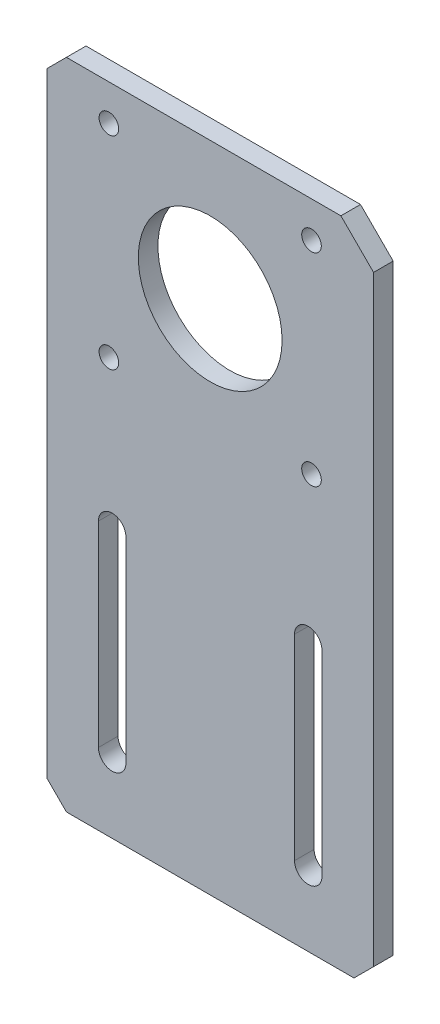
ISO-10303-21;
HEADER;
FILE_DESCRIPTION(('STEP AP214'),'2;1');
FILE_NAME('part.step','',(''),(''),'','','');
FILE_SCHEMA(('AUTOMOTIVE_DESIGN { 1 0 10303 214 1 1 1 1 }'));
ENDSEC;
DATA;
#1=APPLICATION_CONTEXT('core data for automotive mechanical design processes');
#2=APPLICATION_PROTOCOL_DEFINITION('international standard','automotive_design',2000,#1);
#3=PRODUCT_CONTEXT('',#1,'mechanical');
#4=PRODUCT('Part','Part','',(#3));
#5=PRODUCT_RELATED_PRODUCT_CATEGORY('part','',(#4));
#6=PRODUCT_DEFINITION_FORMATION('','',#4);
#7=PRODUCT_DEFINITION_CONTEXT('part definition',#1,'design');
#8=PRODUCT_DEFINITION('design','',#6,#7);
#9=PRODUCT_DEFINITION_SHAPE('','',#8);
#10=(LENGTH_UNIT() NAMED_UNIT(*) SI_UNIT(.MILLI.,.METRE.));
#11=(NAMED_UNIT(*) PLANE_ANGLE_UNIT() SI_UNIT($,.RADIAN.));
#12=(NAMED_UNIT(*) SI_UNIT($,.STERADIAN.) SOLID_ANGLE_UNIT());
#13=UNCERTAINTY_MEASURE_WITH_UNIT(LENGTH_MEASURE(1.E-05),#10,'distance_accuracy_value','');
#14=(GEOMETRIC_REPRESENTATION_CONTEXT(3) GLOBAL_UNCERTAINTY_ASSIGNED_CONTEXT((#13)) GLOBAL_UNIT_ASSIGNED_CONTEXT((#10,
#11,#12)) REPRESENTATION_CONTEXT('',''));
#15=CARTESIAN_POINT('',(0.,0.,0.));
#16=DIRECTION('',(0.,0.,1.));
#17=DIRECTION('',(1.,0.,0.));
#18=AXIS2_PLACEMENT_3D('',#15,#16,#17);
#19=CARTESIAN_POINT('',(22.5,22.5,3.));
#20=DIRECTION('',(0.707106781186547,0.707106781186548,0.));
#21=DIRECTION('',(-0.707106781186548,0.707106781186547,0.));
#22=AXIS2_PLACEMENT_3D('',#19,#20,#21);
#23=PLANE('',#22);
#24=DIRECTION('',(0.707106781186548,-0.707106781186547,0.));
#25=VECTOR('',#24,1.);
#26=CARTESIAN_POINT('',(22.5,22.5,0.));
#27=LINE('',#26,#25);
#28=CARTESIAN_POINT('',(45.,0.,0.));
#29=VERTEX_POINT('',#28);
#30=CARTESIAN_POINT('',(50.,-4.99999999999999,0.));
#31=VERTEX_POINT('',#30);
#32=EDGE_CURVE('E251',#29,#31,#27,.T.);
#33=ORIENTED_EDGE('',*,*,#32,.F.);
#34=DIRECTION('',(0.,0.,-1.));
#35=VECTOR('',#34,1.);
#36=CARTESIAN_POINT('',(45.,0.,3.));
#37=LINE('',#36,#35);
#38=CARTESIAN_POINT('',(45.,0.,3.));
#39=VERTEX_POINT('',#38);
#40=EDGE_CURVE('E269',#39,#29,#37,.T.);
#41=ORIENTED_EDGE('',*,*,#40,.F.);
#42=DIRECTION('',(0.707106781186548,-0.707106781186547,0.));
#43=VECTOR('',#42,1.);
#44=CARTESIAN_POINT('',(22.5,22.5,3.));
#45=LINE('',#44,#43);
#46=CARTESIAN_POINT('',(50.,-4.99999999999999,3.));
#47=VERTEX_POINT('',#46);
#48=EDGE_CURVE('E202',#39,#47,#45,.T.);
#49=ORIENTED_EDGE('',*,*,#48,.T.);
#50=DIRECTION('',(0.,0.,-1.));
#51=VECTOR('',#50,1.);
#52=CARTESIAN_POINT('',(50.,-4.99999999999999,3.));
#53=LINE('',#52,#51);
#54=EDGE_CURVE('E267',#47,#31,#53,.T.);
#55=ORIENTED_EDGE('',*,*,#54,.T.);
#56=EDGE_LOOP('',(#33,#41,#49,#55));
#57=FACE_BOUND('',#56,.T.);
#58=ADVANCED_FACE('F35',(#57),#23,.T.);
#59=CARTESIAN_POINT('',(0.,0.,3.));
#60=DIRECTION('',(0.,1.,0.));
#61=DIRECTION('',(0.,0.,1.));
#62=AXIS2_PLACEMENT_3D('',#59,#60,#61);
#63=PLANE('',#62);
#64=DIRECTION('',(1.,0.,0.));
#65=VECTOR('',#64,1.);
#66=CARTESIAN_POINT('',(0.,0.,0.));
#67=LINE('',#66,#65);
#68=CARTESIAN_POINT('',(3.00000000000002,0.,0.));
#69=VERTEX_POINT('',#68);
#70=EDGE_CURVE('E254',#69,#29,#67,.T.);
#71=ORIENTED_EDGE('',*,*,#70,.F.);
#72=DIRECTION('',(0.,0.,1.));
#73=VECTOR('',#72,1.);
#74=CARTESIAN_POINT('',(3.00000000000002,0.,3.));
#75=LINE('',#74,#73);
#76=CARTESIAN_POINT('',(3.00000000000002,0.,3.));
#77=VERTEX_POINT('',#76);
#78=EDGE_CURVE('E11',#69,#77,#75,.T.);
#79=ORIENTED_EDGE('',*,*,#78,.T.);
#80=DIRECTION('',(1.,0.,0.));
#81=VECTOR('',#80,1.);
#82=CARTESIAN_POINT('',(0.,0.,3.));
#83=LINE('',#82,#81);
#84=EDGE_CURVE('E205',#77,#39,#83,.T.);
#85=ORIENTED_EDGE('',*,*,#84,.T.);
#86=ORIENTED_EDGE('',*,*,#40,.T.);
#87=EDGE_LOOP('',(#71,#79,#85,#86));
#88=FACE_BOUND('',#87,.T.);
#89=ADVANCED_FACE('F346',(#88),#63,.T.);
#90=CARTESIAN_POINT('',(0.,0.,3.));
#91=DIRECTION('',(1.,0.,0.));
#92=DIRECTION('',(0.,1.,0.));
#93=AXIS2_PLACEMENT_3D('',#90,#91,#92);
#94=PLANE('',#93);
#95=DIRECTION('',(0.,-1.,0.));
#96=VECTOR('',#95,1.);
#97=CARTESIAN_POINT('',(0.,0.,0.));
#98=LINE('',#97,#96);
#99=CARTESIAN_POINT('',(0.,-3.00000000000002,0.));
#100=VERTEX_POINT('',#99);
#101=CARTESIAN_POINT('',(0.,-97.,0.));
#102=VERTEX_POINT('',#101);
#103=EDGE_CURVE('E256',#100,#102,#98,.T.);
#104=ORIENTED_EDGE('',*,*,#103,.T.);
#105=DIRECTION('',(0.,0.,1.));
#106=VECTOR('',#105,1.);
#107=CARTESIAN_POINT('',(0.,-97.,3.));
#108=LINE('',#107,#106);
#109=CARTESIAN_POINT('',(0.,-97.,3.));
#110=VERTEX_POINT('',#109);
#111=EDGE_CURVE('E298',#102,#110,#108,.T.);
#112=ORIENTED_EDGE('',*,*,#111,.T.);
#113=DIRECTION('',(0.,-1.,0.));
#114=VECTOR('',#113,1.);
#115=CARTESIAN_POINT('',(0.,0.,3.));
#116=LINE('',#115,#114);
#117=CARTESIAN_POINT('',(0.,-3.00000000000002,3.));
#118=VERTEX_POINT('',#117);
#119=EDGE_CURVE('E207',#118,#110,#116,.T.);
#120=ORIENTED_EDGE('',*,*,#119,.F.);
#121=DIRECTION('',(0.,0.,-1.));
#122=VECTOR('',#121,1.);
#123=CARTESIAN_POINT('',(0.,-3.00000000000002,0.));
#124=LINE('',#123,#122);
#125=EDGE_CURVE('E295',#118,#100,#124,.T.);
#126=ORIENTED_EDGE('',*,*,#125,.T.);
#127=EDGE_LOOP('',(#104,#112,#120,#126));
#128=FACE_BOUND('',#127,.T.);
#129=ADVANCED_FACE('F351',(#128),#94,.F.);
#130=CARTESIAN_POINT('',(0.,-100.,3.));
#131=DIRECTION('',(0.,1.,0.));
#132=DIRECTION('',(0.,0.,1.));
#133=AXIS2_PLACEMENT_3D('',#130,#131,#132);
#134=PLANE('',#133);
#135=DIRECTION('',(1.,0.,0.));
#136=VECTOR('',#135,1.);
#137=CARTESIAN_POINT('',(0.,-100.,3.));
#138=LINE('',#137,#136);
#139=CARTESIAN_POINT('',(3.00000000000001,-100.,3.));
#140=VERTEX_POINT('',#139);
#141=CARTESIAN_POINT('',(47.,-100.,3.));
#142=VERTEX_POINT('',#141);
#143=EDGE_CURVE('E210',#140,#142,#138,.T.);
#144=ORIENTED_EDGE('',*,*,#143,.F.);
#145=DIRECTION('',(0.,0.,-1.));
#146=VECTOR('',#145,1.);
#147=CARTESIAN_POINT('',(3.00000000000001,-100.,3.));
#148=LINE('',#147,#146);
#149=CARTESIAN_POINT('',(3.00000000000001,-100.,0.));
#150=VERTEX_POINT('',#149);
#151=EDGE_CURVE('E286',#140,#150,#148,.T.);
#152=ORIENTED_EDGE('',*,*,#151,.T.);
#153=DIRECTION('',(1.,0.,0.));
#154=VECTOR('',#153,1.);
#155=CARTESIAN_POINT('',(0.,-100.,0.));
#156=LINE('',#155,#154);
#157=CARTESIAN_POINT('',(47.,-100.,0.));
#158=VERTEX_POINT('',#157);
#159=EDGE_CURVE('E259',#150,#158,#156,.T.);
#160=ORIENTED_EDGE('',*,*,#159,.T.);
#161=DIRECTION('',(0.,0.,1.));
#162=VECTOR('',#161,1.);
#163=CARTESIAN_POINT('',(47.,-100.,3.));
#164=LINE('',#163,#162);
#165=EDGE_CURVE('E273',#158,#142,#164,.T.);
#166=ORIENTED_EDGE('',*,*,#165,.T.);
#167=EDGE_LOOP('',(#144,#152,#160,#166));
#168=FACE_BOUND('',#167,.T.);
#169=ADVANCED_FACE('F382',(#168),#134,.F.);
#170=CARTESIAN_POINT('',(10.,-89.,3.));
#171=DIRECTION('',(0.,0.,-1.));
#172=DIRECTION('',(-1.,0.,0.));
#173=AXIS2_PLACEMENT_3D('',#170,#171,#172);
#174=CYLINDRICAL_SURFACE('',#173,2.09999999999999);
#175=CARTESIAN_POINT('',(10.,-89.,0.));
#176=DIRECTION('',(0.,0.,1.));
#177=DIRECTION('',(1.,0.,0.));
#178=AXIS2_PLACEMENT_3D('',#175,#176,#177);
#179=CIRCLE('',#178,2.09999999999999);
#180=CARTESIAN_POINT('',(7.90000000000002,-89.,0.));
#181=VERTEX_POINT('',#180);
#182=CARTESIAN_POINT('',(12.1,-89.,0.));
#183=VERTEX_POINT('',#182);
#184=EDGE_CURVE('E230',#181,#183,#179,.T.);
#185=ORIENTED_EDGE('',*,*,#184,.F.);
#186=DIRECTION('',(0.,0.,-1.));
#187=VECTOR('',#186,1.);
#188=CARTESIAN_POINT('',(7.90000000000002,-89.,3.));
#189=LINE('',#188,#187);
#190=CARTESIAN_POINT('',(7.90000000000002,-89.,3.));
#191=VERTEX_POINT('',#190);
#192=EDGE_CURVE('E270',#191,#181,#189,.T.);
#193=ORIENTED_EDGE('',*,*,#192,.F.);
#194=CARTESIAN_POINT('',(10.,-89.,3.));
#195=DIRECTION('',(0.,0.,1.));
#196=DIRECTION('',(1.,0.,0.));
#197=AXIS2_PLACEMENT_3D('',#194,#195,#196);
#198=CIRCLE('',#197,2.09999999999999);
#199=CARTESIAN_POINT('',(12.1,-89.,3.));
#200=VERTEX_POINT('',#199);
#201=EDGE_CURVE('E182',#191,#200,#198,.T.);
#202=ORIENTED_EDGE('',*,*,#201,.T.);
#203=DIRECTION('',(0.,0.,-1.));
#204=VECTOR('',#203,1.);
#205=CARTESIAN_POINT('',(12.1,-89.,3.));
#206=LINE('',#205,#204);
#207=EDGE_CURVE('E159',#200,#183,#206,.T.);
#208=ORIENTED_EDGE('',*,*,#207,.T.);
#209=EDGE_LOOP('',(#185,#193,#202,#208));
#210=FACE_BOUND('',#209,.T.);
#211=ADVANCED_FACE('F378',(#210),#174,.F.);
#212=CARTESIAN_POINT('',(7.9,0.,3.));
#213=DIRECTION('',(1.,0.,0.));
#214=DIRECTION('',(0.,1.,0.));
#215=AXIS2_PLACEMENT_3D('',#212,#213,#214);
#216=PLANE('',#215);
#217=DIRECTION('',(0.,-1.,0.));
#218=VECTOR('',#217,1.);
#219=CARTESIAN_POINT('',(7.9,0.,0.));
#220=LINE('',#219,#218);
#221=CARTESIAN_POINT('',(7.90000000000001,-59.,0.));
#222=VERTEX_POINT('',#221);
#223=EDGE_CURVE('E233',#222,#181,#220,.T.);
#224=ORIENTED_EDGE('',*,*,#223,.F.);
#225=DIRECTION('',(0.,0.,-1.));
#226=VECTOR('',#225,1.);
#227=CARTESIAN_POINT('',(7.90000000000001,-59.,3.));
#228=LINE('',#227,#226);
#229=CARTESIAN_POINT('',(7.90000000000001,-59.,3.));
#230=VERTEX_POINT('',#229);
#231=EDGE_CURVE('E278',#230,#222,#228,.T.);
#232=ORIENTED_EDGE('',*,*,#231,.F.);
#233=DIRECTION('',(0.,-1.,0.));
#234=VECTOR('',#233,1.);
#235=CARTESIAN_POINT('',(7.9,0.,3.));
#236=LINE('',#235,#234);
#237=EDGE_CURVE('E185',#230,#191,#236,.T.);
#238=ORIENTED_EDGE('',*,*,#237,.T.);
#239=ORIENTED_EDGE('',*,*,#192,.T.);
#240=EDGE_LOOP('',(#224,#232,#238,#239));
#241=FACE_BOUND('',#240,.T.);
#242=ADVANCED_FACE('F374',(#241),#216,.T.);
#243=CARTESIAN_POINT('',(10.,-59.,3.));
#244=DIRECTION('',(0.,0.,-1.));
#245=DIRECTION('',(-1.,0.,0.));
#246=AXIS2_PLACEMENT_3D('',#243,#244,#245);
#247=CYLINDRICAL_SURFACE('',#246,2.1);
#248=CARTESIAN_POINT('',(10.,-59.,0.));
#249=DIRECTION('',(0.,0.,1.));
#250=DIRECTION('',(1.,0.,0.));
#251=AXIS2_PLACEMENT_3D('',#248,#249,#250);
#252=CIRCLE('',#251,2.1);
#253=CARTESIAN_POINT('',(12.1,-59.,0.));
#254=VERTEX_POINT('',#253);
#255=EDGE_CURVE('E236',#222,#254,#252,.F.);
#256=ORIENTED_EDGE('',*,*,#255,.T.);
#257=DIRECTION('',(0.,0.,-1.));
#258=VECTOR('',#257,1.);
#259=CARTESIAN_POINT('',(12.1,-59.,3.));
#260=LINE('',#259,#258);
#261=CARTESIAN_POINT('',(12.1,-59.,3.));
#262=VERTEX_POINT('',#261);
#263=EDGE_CURVE('E275',#262,#254,#260,.T.);
#264=ORIENTED_EDGE('',*,*,#263,.F.);
#265=CARTESIAN_POINT('',(10.,-59.,3.));
#266=DIRECTION('',(0.,0.,1.));
#267=DIRECTION('',(1.,0.,0.));
#268=AXIS2_PLACEMENT_3D('',#265,#266,#267);
#269=CIRCLE('',#268,2.1);
#270=EDGE_CURVE('E188',#230,#262,#269,.F.);
#271=ORIENTED_EDGE('',*,*,#270,.F.);
#272=ORIENTED_EDGE('',*,*,#231,.T.);
#273=EDGE_LOOP('',(#256,#264,#271,#272));
#274=FACE_BOUND('',#273,.T.);
#275=ADVANCED_FACE('F371',(#274),#247,.F.);
#276=CARTESIAN_POINT('',(40.,-59.,3.));
#277=DIRECTION('',(0.,0.,-1.));
#278=DIRECTION('',(-1.,0.,0.));
#279=AXIS2_PLACEMENT_3D('',#276,#277,#278);
#280=CYLINDRICAL_SURFACE('',#279,2.09999999999999);
#281=CARTESIAN_POINT('',(40.,-59.,0.));
#282=DIRECTION('',(0.,0.,1.));
#283=DIRECTION('',(1.,0.,0.));
#284=AXIS2_PLACEMENT_3D('',#281,#282,#283);
#285=CIRCLE('',#284,2.09999999999999);
#286=CARTESIAN_POINT('',(42.1,-59.,0.));
#287=VERTEX_POINT('',#286);
#288=CARTESIAN_POINT('',(37.9,-59.,0.));
#289=VERTEX_POINT('',#288);
#290=EDGE_CURVE('E156',#287,#289,#285,.T.);
#291=ORIENTED_EDGE('',*,*,#290,.F.);
#292=DIRECTION('',(0.,0.,-1.));
#293=VECTOR('',#292,1.);
#294=CARTESIAN_POINT('',(42.1,-59.,3.));
#295=LINE('',#294,#293);
#296=CARTESIAN_POINT('',(42.1,-59.,3.));
#297=VERTEX_POINT('',#296);
#298=EDGE_CURVE('E149',#297,#287,#295,.T.);
#299=ORIENTED_EDGE('',*,*,#298,.F.);
#300=CARTESIAN_POINT('',(40.,-59.,3.));
#301=DIRECTION('',(0.,0.,1.));
#302=DIRECTION('',(1.,0.,0.));
#303=AXIS2_PLACEMENT_3D('',#300,#301,#302);
#304=CIRCLE('',#303,2.09999999999999);
#305=CARTESIAN_POINT('',(37.9,-59.,3.));
#306=VERTEX_POINT('',#305);
#307=EDGE_CURVE('E153',#297,#306,#304,.T.);
#308=ORIENTED_EDGE('',*,*,#307,.T.);
#309=DIRECTION('',(0.,0.,-1.));
#310=VECTOR('',#309,1.);
#311=CARTESIAN_POINT('',(37.9,-59.,3.));
#312=LINE('',#311,#310);
#313=EDGE_CURVE('E220',#306,#289,#312,.T.);
#314=ORIENTED_EDGE('',*,*,#313,.T.);
#315=EDGE_LOOP('',(#291,#299,#308,#314));
#316=FACE_BOUND('',#315,.T.);
#317=ADVANCED_FACE('F151',(#316),#280,.F.);
#318=CARTESIAN_POINT('',(42.1,0.,3.));
#319=DIRECTION('',(1.,0.,0.));
#320=DIRECTION('',(0.,1.,0.));
#321=AXIS2_PLACEMENT_3D('',#318,#319,#320);
#322=PLANE('',#321);
#323=DIRECTION('',(0.,-1.,0.));
#324=VECTOR('',#323,1.);
#325=CARTESIAN_POINT('',(42.1,0.,0.));
#326=LINE('',#325,#324);
#327=CARTESIAN_POINT('',(42.1,-89.,0.));
#328=VERTEX_POINT('',#327);
#329=EDGE_CURVE('E222',#287,#328,#326,.T.);
#330=ORIENTED_EDGE('',*,*,#329,.T.);
#331=DIRECTION('',(0.,0.,-1.));
#332=VECTOR('',#331,1.);
#333=CARTESIAN_POINT('',(42.1,-89.,3.));
#334=LINE('',#333,#332);
#335=CARTESIAN_POINT('',(42.1,-89.,3.));
#336=VERTEX_POINT('',#335);
#337=EDGE_CURVE('E160',#336,#328,#334,.T.);
#338=ORIENTED_EDGE('',*,*,#337,.F.);
#339=DIRECTION('',(0.,-1.,0.));
#340=VECTOR('',#339,1.);
#341=CARTESIAN_POINT('',(42.1,0.,3.));
#342=LINE('',#341,#340);
#343=EDGE_CURVE('E163',#297,#336,#342,.T.);
#344=ORIENTED_EDGE('',*,*,#343,.F.);
#345=ORIENTED_EDGE('',*,*,#298,.T.);
#346=EDGE_LOOP('',(#330,#338,#344,#345));
#347=FACE_BOUND('',#346,.T.);
#348=ADVANCED_FACE('F164',(#347),#322,.F.);
#349=CARTESIAN_POINT('',(40.,-89.,3.));
#350=DIRECTION('',(0.,0.,-1.));
#351=DIRECTION('',(-1.,0.,0.));
#352=AXIS2_PLACEMENT_3D('',#349,#350,#351);
#353=CYLINDRICAL_SURFACE('',#352,2.1);
#354=CARTESIAN_POINT('',(40.,-89.,0.));
#355=DIRECTION('',(0.,0.,1.));
#356=DIRECTION('',(1.,0.,0.));
#357=AXIS2_PLACEMENT_3D('',#354,#355,#356);
#358=CIRCLE('',#357,2.1);
#359=CARTESIAN_POINT('',(37.9,-89.,0.));
#360=VERTEX_POINT('',#359);
#361=EDGE_CURVE('E224',#328,#360,#358,.F.);
#362=ORIENTED_EDGE('',*,*,#361,.T.);
#363=DIRECTION('',(0.,0.,-1.));
#364=VECTOR('',#363,1.);
#365=CARTESIAN_POINT('',(37.9,-89.,3.));
#366=LINE('',#365,#364);
#367=CARTESIAN_POINT('',(37.9,-89.,3.));
#368=VERTEX_POINT('',#367);
#369=EDGE_CURVE('E282',#368,#360,#366,.T.);
#370=ORIENTED_EDGE('',*,*,#369,.F.);
#371=CARTESIAN_POINT('',(40.,-89.,3.));
#372=DIRECTION('',(0.,0.,1.));
#373=DIRECTION('',(1.,0.,0.));
#374=AXIS2_PLACEMENT_3D('',#371,#372,#373);
#375=CIRCLE('',#374,2.1);
#376=EDGE_CURVE('E168',#336,#368,#375,.F.);
#377=ORIENTED_EDGE('',*,*,#376,.F.);
#378=ORIENTED_EDGE('',*,*,#337,.T.);
#379=EDGE_LOOP('',(#362,#370,#377,#378));
#380=FACE_BOUND('',#379,.T.);
#381=ADVANCED_FACE('F387',(#380),#353,.F.);
#382=CARTESIAN_POINT('',(40.5,-36.5,3.));
#383=DIRECTION('',(0.,0.,-1.));
#384=DIRECTION('',(-1.,0.,0.));
#385=AXIS2_PLACEMENT_3D('',#382,#383,#384);
#386=CYLINDRICAL_SURFACE('',#385,1.5);
#387=CARTESIAN_POINT('',(40.5,-36.5,3.));
#388=DIRECTION('',(0.,0.,1.));
#389=DIRECTION('',(1.,0.,0.));
#390=AXIS2_PLACEMENT_3D('',#387,#388,#389);
#391=CIRCLE('',#390,1.5);
#392=CARTESIAN_POINT('',(42.,-36.5,3.));
#393=VERTEX_POINT('',#392);
#394=EDGE_CURVE('E214',#393,#393,#391,.T.);
#395=ORIENTED_EDGE('',*,*,#394,.T.);
#396=EDGE_LOOP('',(#395));
#397=FACE_BOUND('',#396,.T.);
#398=CARTESIAN_POINT('',(40.5,-36.5,0.));
#399=DIRECTION('',(0.,0.,1.));
#400=DIRECTION('',(1.,0.,0.));
#401=AXIS2_PLACEMENT_3D('',#398,#399,#400);
#402=CIRCLE('',#401,1.5);
#403=CARTESIAN_POINT('',(42.,-36.5,0.));
#404=VERTEX_POINT('',#403);
#405=EDGE_CURVE('E177',#404,#404,#402,.T.);
#406=ORIENTED_EDGE('',*,*,#405,.F.);
#407=EDGE_LOOP('',(#406));
#408=FACE_BOUND('',#407,.T.);
#409=ADVANCED_FACE('F390',(#397,#408),#386,.F.);
#410=CARTESIAN_POINT('',(50.,0.,3.));
#411=DIRECTION('',(1.,0.,0.));
#412=DIRECTION('',(0.,1.,0.));
#413=AXIS2_PLACEMENT_3D('',#410,#411,#412);
#414=PLANE('',#413);
#415=DIRECTION('',(0.,-1.,0.));
#416=VECTOR('',#415,1.);
#417=CARTESIAN_POINT('',(50.,0.,3.));
#418=LINE('',#417,#416);
#419=CARTESIAN_POINT('',(50.,-97.,3.));
#420=VERTEX_POINT('',#419);
#421=EDGE_CURVE('E212',#47,#420,#418,.T.);
#422=ORIENTED_EDGE('',*,*,#421,.T.);
#423=DIRECTION('',(0.,0.,-1.));
#424=VECTOR('',#423,1.);
#425=CARTESIAN_POINT('',(50.,-97.,0.));
#426=LINE('',#425,#424);
#427=CARTESIAN_POINT('',(50.,-97.,0.));
#428=VERTEX_POINT('',#427);
#429=EDGE_CURVE('E43',#420,#428,#426,.T.);
#430=ORIENTED_EDGE('',*,*,#429,.T.);
#431=DIRECTION('',(0.,-1.,0.));
#432=VECTOR('',#431,1.);
#433=CARTESIAN_POINT('',(50.,0.,0.));
#434=LINE('',#433,#432);
#435=EDGE_CURVE('E262',#31,#428,#434,.T.);
#436=ORIENTED_EDGE('',*,*,#435,.F.);
#437=ORIENTED_EDGE('',*,*,#54,.F.);
#438=EDGE_LOOP('',(#422,#430,#436,#437));
#439=FACE_BOUND('',#438,.T.);
#440=ADVANCED_FACE('F308',(#439),#414,.T.);
#441=CARTESIAN_POINT('',(25.,-21.,3.));
#442=DIRECTION('',(0.,0.,-1.));
#443=DIRECTION('',(-1.,0.,0.));
#444=AXIS2_PLACEMENT_3D('',#441,#442,#443);
#445=CYLINDRICAL_SURFACE('',#444,11.);
#446=CARTESIAN_POINT('',(25.,-21.,3.));
#447=DIRECTION('',(0.,0.,1.));
#448=DIRECTION('',(1.,0.,0.));
#449=AXIS2_PLACEMENT_3D('',#446,#447,#448);
#450=CIRCLE('',#449,11.);
#451=CARTESIAN_POINT('',(36.,-21.,3.));
#452=VERTEX_POINT('',#451);
#453=EDGE_CURVE('E199',#452,#452,#450,.T.);
#454=ORIENTED_EDGE('',*,*,#453,.T.);
#455=EDGE_LOOP('',(#454));
#456=FACE_BOUND('',#455,.T.);
#457=CARTESIAN_POINT('',(25.,-21.,0.));
#458=DIRECTION('',(0.,0.,1.));
#459=DIRECTION('',(1.,0.,0.));
#460=AXIS2_PLACEMENT_3D('',#457,#458,#459);
#461=CIRCLE('',#460,11.);
#462=CARTESIAN_POINT('',(36.,-21.,0.));
#463=VERTEX_POINT('',#462);
#464=EDGE_CURVE('E248',#463,#463,#461,.T.);
#465=ORIENTED_EDGE('',*,*,#464,.F.);
#466=EDGE_LOOP('',(#465));
#467=FACE_BOUND('',#466,.T.);
#468=ADVANCED_FACE('F355',(#456,#467),#445,.F.);
#469=CARTESIAN_POINT('',(9.5,-5.5,3.));
#470=DIRECTION('',(0.,0.,-1.));
#471=DIRECTION('',(-1.,0.,0.));
#472=AXIS2_PLACEMENT_3D('',#469,#470,#471);
#473=CYLINDRICAL_SURFACE('',#472,1.5);
#474=CARTESIAN_POINT('',(9.5,-5.5,3.));
#475=DIRECTION('',(0.,0.,1.));
#476=DIRECTION('',(1.,0.,0.));
#477=AXIS2_PLACEMENT_3D('',#474,#475,#476);
#478=CIRCLE('',#477,1.5);
#479=CARTESIAN_POINT('',(11.,-5.5,3.));
#480=VERTEX_POINT('',#479);
#481=EDGE_CURVE('E196',#480,#480,#478,.T.);
#482=ORIENTED_EDGE('',*,*,#481,.T.);
#483=EDGE_LOOP('',(#482));
#484=FACE_BOUND('',#483,.T.);
#485=CARTESIAN_POINT('',(9.5,-5.5,0.));
#486=DIRECTION('',(0.,0.,1.));
#487=DIRECTION('',(1.,0.,0.));
#488=AXIS2_PLACEMENT_3D('',#485,#486,#487);
#489=CIRCLE('',#488,1.5);
#490=CARTESIAN_POINT('',(11.,-5.5,0.));
#491=VERTEX_POINT('',#490);
#492=EDGE_CURVE('E245',#491,#491,#489,.T.);
#493=ORIENTED_EDGE('',*,*,#492,.F.);
#494=EDGE_LOOP('',(#493));
#495=FACE_BOUND('',#494,.T.);
#496=ADVANCED_FACE('F358',(#484,#495),#473,.F.);
#497=CARTESIAN_POINT('',(9.5,-36.5,3.));
#498=DIRECTION('',(0.,0.,-1.));
#499=DIRECTION('',(-1.,0.,0.));
#500=AXIS2_PLACEMENT_3D('',#497,#498,#499);
#501=CYLINDRICAL_SURFACE('',#500,1.5);
#502=CARTESIAN_POINT('',(9.5,-36.5,3.));
#503=DIRECTION('',(0.,0.,1.));
#504=DIRECTION('',(1.,0.,0.));
#505=AXIS2_PLACEMENT_3D('',#502,#503,#504);
#506=CIRCLE('',#505,1.5);
#507=CARTESIAN_POINT('',(11.,-36.5,3.));
#508=VERTEX_POINT('',#507);
#509=EDGE_CURVE('E193',#508,#508,#506,.F.);
#510=ORIENTED_EDGE('',*,*,#509,.F.);
#511=EDGE_LOOP('',(#510));
#512=FACE_BOUND('',#511,.T.);
#513=CARTESIAN_POINT('',(9.5,-36.5,0.));
#514=DIRECTION('',(0.,0.,1.));
#515=DIRECTION('',(1.,0.,0.));
#516=AXIS2_PLACEMENT_3D('',#513,#514,#515);
#517=CIRCLE('',#516,1.5);
#518=CARTESIAN_POINT('',(11.,-36.5,0.));
#519=VERTEX_POINT('',#518);
#520=EDGE_CURVE('E242',#519,#519,#517,.F.);
#521=ORIENTED_EDGE('',*,*,#520,.T.);
#522=EDGE_LOOP('',(#521));
#523=FACE_BOUND('',#522,.T.);
#524=ADVANCED_FACE('F362',(#512,#523),#501,.F.);
#525=CARTESIAN_POINT('',(12.1,0.,3.));
#526=DIRECTION('',(1.,0.,0.));
#527=DIRECTION('',(0.,0.,-1.));
#528=AXIS2_PLACEMENT_3D('',#525,#526,#527);
#529=PLANE('',#528);
#530=DIRECTION('',(0.,-1.,0.));
#531=VECTOR('',#530,1.);
#532=CARTESIAN_POINT('',(12.1,0.,0.));
#533=LINE('',#532,#531);
#534=EDGE_CURVE('E239',#254,#183,#533,.T.);
#535=ORIENTED_EDGE('',*,*,#534,.T.);
#536=ORIENTED_EDGE('',*,*,#207,.F.);
#537=DIRECTION('',(0.,-1.,0.));
#538=VECTOR('',#537,1.);
#539=CARTESIAN_POINT('',(12.1,0.,3.));
#540=LINE('',#539,#538);
#541=EDGE_CURVE('E191',#262,#200,#540,.T.);
#542=ORIENTED_EDGE('',*,*,#541,.F.);
#543=ORIENTED_EDGE('',*,*,#263,.T.);
#544=EDGE_LOOP('',(#535,#536,#542,#543));
#545=FACE_BOUND('',#544,.T.);
#546=ADVANCED_FACE('F366',(#545),#529,.F.);
#547=CARTESIAN_POINT('',(37.9,0.,3.));
#548=DIRECTION('',(1.,0.,0.));
#549=DIRECTION('',(0.,0.,-1.));
#550=AXIS2_PLACEMENT_3D('',#547,#548,#549);
#551=PLANE('',#550);
#552=DIRECTION('',(0.,-1.,0.));
#553=VECTOR('',#552,1.);
#554=CARTESIAN_POINT('',(37.9,0.,0.));
#555=LINE('',#554,#553);
#556=EDGE_CURVE('E227',#289,#360,#555,.T.);
#557=ORIENTED_EDGE('',*,*,#556,.F.);
#558=ORIENTED_EDGE('',*,*,#313,.F.);
#559=DIRECTION('',(0.,-1.,0.));
#560=VECTOR('',#559,1.);
#561=CARTESIAN_POINT('',(37.9,0.,3.));
#562=LINE('',#561,#560);
#563=EDGE_CURVE('E173',#306,#368,#562,.T.);
#564=ORIENTED_EDGE('',*,*,#563,.T.);
#565=ORIENTED_EDGE('',*,*,#369,.T.);
#566=EDGE_LOOP('',(#557,#558,#564,#565));
#567=FACE_BOUND('',#566,.T.);
#568=ADVANCED_FACE('F330',(#567),#551,.T.);
#569=CARTESIAN_POINT('',(40.5,-5.5,3.));
#570=DIRECTION('',(0.,0.,-1.));
#571=DIRECTION('',(-1.,0.,0.));
#572=AXIS2_PLACEMENT_3D('',#569,#570,#571);
#573=CYLINDRICAL_SURFACE('',#572,1.5);
#574=CARTESIAN_POINT('',(40.5,-5.5,3.));
#575=DIRECTION('',(0.,0.,1.));
#576=DIRECTION('',(1.,0.,0.));
#577=AXIS2_PLACEMENT_3D('',#574,#575,#576);
#578=CIRCLE('',#577,1.5);
#579=CARTESIAN_POINT('',(42.,-5.5,3.));
#580=VERTEX_POINT('',#579);
#581=EDGE_CURVE('E217',#580,#580,#578,.F.);
#582=ORIENTED_EDGE('',*,*,#581,.F.);
#583=EDGE_LOOP('',(#582));
#584=FACE_BOUND('',#583,.T.);
#585=CARTESIAN_POINT('',(40.5,-5.5,0.));
#586=DIRECTION('',(0.,0.,1.));
#587=DIRECTION('',(1.,0.,0.));
#588=AXIS2_PLACEMENT_3D('',#585,#586,#587);
#589=CIRCLE('',#588,1.5);
#590=CARTESIAN_POINT('',(42.,-5.5,0.));
#591=VERTEX_POINT('',#590);
#592=EDGE_CURVE('E174',#591,#591,#589,.F.);
#593=ORIENTED_EDGE('',*,*,#592,.T.);
#594=EDGE_LOOP('',(#593));
#595=FACE_BOUND('',#594,.T.);
#596=ADVANCED_FACE('F322',(#584,#595),#573,.F.);
#597=CARTESIAN_POINT('',(0.,0.,3.));
#598=DIRECTION('',(0.,0.,1.));
#599=DIRECTION('',(1.,0.,0.));
#600=AXIS2_PLACEMENT_3D('',#597,#598,#599);
#601=PLANE('',#600);
#602=ORIENTED_EDGE('',*,*,#307,.F.);
#603=ORIENTED_EDGE('',*,*,#343,.T.);
#604=ORIENTED_EDGE('',*,*,#376,.T.);
#605=ORIENTED_EDGE('',*,*,#563,.F.);
#606=EDGE_LOOP('',(#602,#603,#604,#605));
#607=FACE_BOUND('',#606,.T.);
#608=ORIENTED_EDGE('',*,*,#201,.F.);
#609=ORIENTED_EDGE('',*,*,#237,.F.);
#610=ORIENTED_EDGE('',*,*,#270,.T.);
#611=ORIENTED_EDGE('',*,*,#541,.T.);
#612=EDGE_LOOP('',(#608,#609,#610,#611));
#613=FACE_BOUND('',#612,.T.);
#614=ORIENTED_EDGE('',*,*,#509,.T.);
#615=EDGE_LOOP('',(#614));
#616=FACE_BOUND('',#615,.T.);
#617=ORIENTED_EDGE('',*,*,#481,.F.);
#618=EDGE_LOOP('',(#617));
#619=FACE_BOUND('',#618,.T.);
#620=ORIENTED_EDGE('',*,*,#453,.F.);
#621=EDGE_LOOP('',(#620));
#622=FACE_BOUND('',#621,.T.);
#623=ORIENTED_EDGE('',*,*,#119,.T.);
#624=DIRECTION('',(-0.707106781186546,0.707106781186549,0.));
#625=VECTOR('',#624,1.);
#626=CARTESIAN_POINT('',(-48.5,-48.4999999999998,3.));
#627=LINE('',#626,#625);
#628=EDGE_CURVE('E303',#110,#140,#627,.F.);
#629=ORIENTED_EDGE('',*,*,#628,.T.);
#630=ORIENTED_EDGE('',*,*,#143,.T.);
#631=DIRECTION('',(0.707106781186549,0.707106781186546,0.));
#632=VECTOR('',#631,1.);
#633=CARTESIAN_POINT('',(73.4999999999999,-73.5000000000002,3.));
#634=LINE('',#633,#632);
#635=EDGE_CURVE('E50',#142,#420,#634,.T.);
#636=ORIENTED_EDGE('',*,*,#635,.T.);
#637=ORIENTED_EDGE('',*,*,#421,.F.);
#638=ORIENTED_EDGE('',*,*,#48,.F.);
#639=ORIENTED_EDGE('',*,*,#84,.F.);
#640=DIRECTION('',(-0.707106781186548,-0.707106781186548,0.));
#641=VECTOR('',#640,1.);
#642=CARTESIAN_POINT('',(1.50000000000001,-1.50000000000001,3.));
#643=LINE('',#642,#641);
#644=EDGE_CURVE('E300',#77,#118,#643,.T.);
#645=ORIENTED_EDGE('',*,*,#644,.T.);
#646=EDGE_LOOP('',(#623,#629,#630,#636,#637,#638,#639,#645));
#647=FACE_BOUND('',#646,.T.);
#648=ORIENTED_EDGE('',*,*,#394,.F.);
#649=EDGE_LOOP('',(#648));
#650=FACE_BOUND('',#649,.T.);
#651=ORIENTED_EDGE('',*,*,#581,.T.);
#652=EDGE_LOOP('',(#651));
#653=FACE_BOUND('',#652,.T.);
#654=ADVANCED_FACE('F170',(#607,#613,#616,#619,#622,#647,#650,#653),#601,.T.);
#655=CARTESIAN_POINT('',(0.,0.,0.));
#656=DIRECTION('',(0.,0.,1.));
#657=DIRECTION('',(1.,0.,0.));
#658=AXIS2_PLACEMENT_3D('',#655,#656,#657);
#659=PLANE('',#658);
#660=ORIENTED_EDGE('',*,*,#290,.T.);
#661=ORIENTED_EDGE('',*,*,#556,.T.);
#662=ORIENTED_EDGE('',*,*,#361,.F.);
#663=ORIENTED_EDGE('',*,*,#329,.F.);
#664=EDGE_LOOP('',(#660,#661,#662,#663));
#665=FACE_BOUND('',#664,.T.);
#666=ORIENTED_EDGE('',*,*,#184,.T.);
#667=ORIENTED_EDGE('',*,*,#534,.F.);
#668=ORIENTED_EDGE('',*,*,#255,.F.);
#669=ORIENTED_EDGE('',*,*,#223,.T.);
#670=EDGE_LOOP('',(#666,#667,#668,#669));
#671=FACE_BOUND('',#670,.T.);
#672=ORIENTED_EDGE('',*,*,#520,.F.);
#673=EDGE_LOOP('',(#672));
#674=FACE_BOUND('',#673,.T.);
#675=ORIENTED_EDGE('',*,*,#492,.T.);
#676=EDGE_LOOP('',(#675));
#677=FACE_BOUND('',#676,.T.);
#678=ORIENTED_EDGE('',*,*,#464,.T.);
#679=EDGE_LOOP('',(#678));
#680=FACE_BOUND('',#679,.T.);
#681=ORIENTED_EDGE('',*,*,#159,.F.);
#682=DIRECTION('',(0.707106781186546,-0.707106781186549,0.));
#683=VECTOR('',#682,1.);
#684=CARTESIAN_POINT('',(3.00000000000001,-100.,0.));
#685=LINE('',#684,#683);
#686=EDGE_CURVE('E293',#150,#102,#685,.F.);
#687=ORIENTED_EDGE('',*,*,#686,.T.);
#688=ORIENTED_EDGE('',*,*,#103,.F.);
#689=DIRECTION('',(0.707106781186548,0.707106781186548,0.));
#690=VECTOR('',#689,1.);
#691=CARTESIAN_POINT('',(0.,-3.00000000000002,0.));
#692=LINE('',#691,#690);
#693=EDGE_CURVE('E289',#100,#69,#692,.T.);
#694=ORIENTED_EDGE('',*,*,#693,.T.);
#695=ORIENTED_EDGE('',*,*,#70,.T.);
#696=ORIENTED_EDGE('',*,*,#32,.T.);
#697=ORIENTED_EDGE('',*,*,#435,.T.);
#698=DIRECTION('',(-0.707106781186549,-0.707106781186546,0.));
#699=VECTOR('',#698,1.);
#700=CARTESIAN_POINT('',(50.,-97.,0.));
#701=LINE('',#700,#699);
#702=EDGE_CURVE('E291',#428,#158,#701,.T.);
#703=ORIENTED_EDGE('',*,*,#702,.T.);
#704=EDGE_LOOP('',(#681,#687,#688,#694,#695,#696,#697,#703));
#705=FACE_BOUND('',#704,.T.);
#706=ORIENTED_EDGE('',*,*,#405,.T.);
#707=EDGE_LOOP('',(#706));
#708=FACE_BOUND('',#707,.T.);
#709=ORIENTED_EDGE('',*,*,#592,.F.);
#710=EDGE_LOOP('',(#709));
#711=FACE_BOUND('',#710,.T.);
#712=ADVANCED_FACE('F312',(#665,#671,#674,#677,#680,#705,#708,#711),#659,.F.);
#713=CARTESIAN_POINT('',(3.00000000000001,-100.,3.));
#714=DIRECTION('',(0.707106781186549,0.707106781186546,0.));
#715=DIRECTION('',(0.,0.,-1.));
#716=AXIS2_PLACEMENT_3D('',#713,#714,#715);
#717=PLANE('',#716);
#718=ORIENTED_EDGE('',*,*,#628,.F.);
#719=ORIENTED_EDGE('',*,*,#111,.F.);
#720=ORIENTED_EDGE('',*,*,#686,.F.);
#721=ORIENTED_EDGE('',*,*,#151,.F.);
#722=EDGE_LOOP('',(#718,#719,#720,#721));
#723=FACE_BOUND('',#722,.T.);
#724=ADVANCED_FACE('F335',(#723),#717,.F.);
#725=CARTESIAN_POINT('',(50.,-97.,3.));
#726=DIRECTION('',(0.707106781186546,-0.707106781186549,0.));
#727=DIRECTION('',(0.,0.,1.));
#728=AXIS2_PLACEMENT_3D('',#725,#726,#727);
#729=PLANE('',#728);
#730=ORIENTED_EDGE('',*,*,#635,.F.);
#731=ORIENTED_EDGE('',*,*,#165,.F.);
#732=ORIENTED_EDGE('',*,*,#702,.F.);
#733=ORIENTED_EDGE('',*,*,#429,.F.);
#734=EDGE_LOOP('',(#730,#731,#732,#733));
#735=FACE_BOUND('',#734,.T.);
#736=ADVANCED_FACE('F341',(#735),#729,.T.);
#737=CARTESIAN_POINT('',(0.,-3.00000000000002,3.));
#738=DIRECTION('',(-0.707106781186548,0.707106781186548,0.));
#739=DIRECTION('',(0.,0.,1.));
#740=AXIS2_PLACEMENT_3D('',#737,#738,#739);
#741=PLANE('',#740);
#742=ORIENTED_EDGE('',*,*,#644,.F.);
#743=ORIENTED_EDGE('',*,*,#78,.F.);
#744=ORIENTED_EDGE('',*,*,#693,.F.);
#745=ORIENTED_EDGE('',*,*,#125,.F.);
#746=EDGE_LOOP('',(#742,#743,#744,#745));
#747=FACE_BOUND('',#746,.T.);
#748=ADVANCED_FACE('F37',(#747),#741,.T.);
#749=CLOSED_SHELL('',(#58,#89,#129,#169,#211,#242,#275,#317,#348,#381,#409,#440,#468,#496,#524,
#546,#568,#596,#654,#712,#724,#736,#748));
#750=MANIFOLD_SOLID_BREP('B2',#749);
#751=ADVANCED_BREP_SHAPE_REPRESENTATION('',(#18,#750),#14);
#752=SHAPE_DEFINITION_REPRESENTATION(#9,#751);
ENDSEC;
END-ISO-10303-21;
